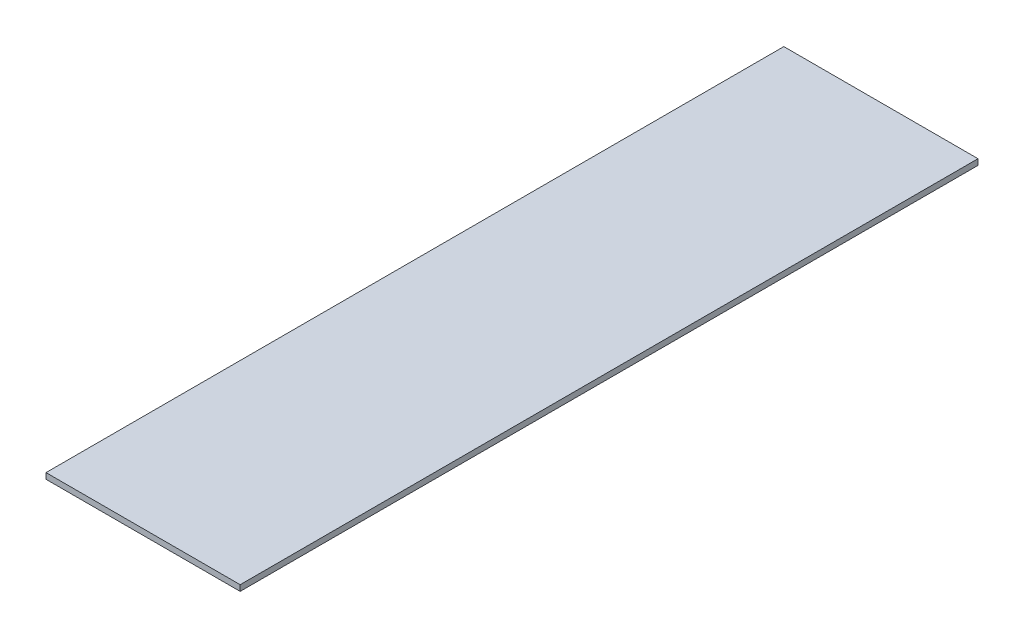
ISO-10303-21;
HEADER;
FILE_DESCRIPTION(('STEP AP214'),'2;1');
FILE_NAME('part.step','',(''),(''),'','','');
FILE_SCHEMA(('AUTOMOTIVE_DESIGN { 1 0 10303 214 1 1 1 1 }'));
ENDSEC;
DATA;
#1=APPLICATION_CONTEXT('core data for automotive mechanical design processes');
#2=APPLICATION_PROTOCOL_DEFINITION('international standard','automotive_design',2000,#1);
#3=PRODUCT_CONTEXT('',#1,'mechanical');
#4=PRODUCT('Part','Part','',(#3));
#5=PRODUCT_RELATED_PRODUCT_CATEGORY('part','',(#4));
#6=PRODUCT_DEFINITION_FORMATION('','',#4);
#7=PRODUCT_DEFINITION_CONTEXT('part definition',#1,'design');
#8=PRODUCT_DEFINITION('design','',#6,#7);
#9=PRODUCT_DEFINITION_SHAPE('','',#8);
#10=(LENGTH_UNIT() NAMED_UNIT(*) SI_UNIT(.MILLI.,.METRE.));
#11=(NAMED_UNIT(*) PLANE_ANGLE_UNIT() SI_UNIT($,.RADIAN.));
#12=(NAMED_UNIT(*) SI_UNIT($,.STERADIAN.) SOLID_ANGLE_UNIT());
#13=UNCERTAINTY_MEASURE_WITH_UNIT(LENGTH_MEASURE(1.E-05),#10,'distance_accuracy_value','');
#14=(GEOMETRIC_REPRESENTATION_CONTEXT(3) GLOBAL_UNCERTAINTY_ASSIGNED_CONTEXT((#13)) GLOBAL_UNIT_ASSIGNED_CONTEXT((#10,
#11,#12)) REPRESENTATION_CONTEXT('',''));
#15=CARTESIAN_POINT('',(0.,0.,0.));
#16=DIRECTION('',(0.,0.,1.));
#17=DIRECTION('',(1.,0.,0.));
#18=AXIS2_PLACEMENT_3D('',#15,#16,#17);
#19=CARTESIAN_POINT('',(0.,1.905,0.));
#20=DIRECTION('',(1.,0.,0.));
#21=DIRECTION('',(0.,0.,-1.));
#22=AXIS2_PLACEMENT_3D('',#19,#20,#21);
#23=PLANE('',#22);
#24=DIRECTION('',(0.,0.,1.));
#25=VECTOR('',#24,1.);
#26=CARTESIAN_POINT('',(0.,0.,0.));
#27=LINE('',#26,#25);
#28=CARTESIAN_POINT('',(0.,0.,-241.3));
#29=VERTEX_POINT('',#28);
#30=CARTESIAN_POINT('',(0.,0.,0.));
#31=VERTEX_POINT('',#30);
#32=EDGE_CURVE('E111',#29,#31,#27,.T.);
#33=ORIENTED_EDGE('',*,*,#32,.T.);
#34=DIRECTION('',(0.,-1.,0.));
#35=VECTOR('',#34,1.);
#36=CARTESIAN_POINT('',(0.,1.905,0.));
#37=LINE('',#36,#35);
#38=CARTESIAN_POINT('',(0.,1.905,0.));
#39=VERTEX_POINT('',#38);
#40=EDGE_CURVE('E11',#39,#31,#37,.T.);
#41=ORIENTED_EDGE('',*,*,#40,.F.);
#42=DIRECTION('',(0.,0.,1.));
#43=VECTOR('',#42,1.);
#44=CARTESIAN_POINT('',(0.,1.905,0.));
#45=LINE('',#44,#43);
#46=CARTESIAN_POINT('',(0.,1.905,-241.3));
#47=VERTEX_POINT('',#46);
#48=EDGE_CURVE('E95',#47,#39,#45,.T.);
#49=ORIENTED_EDGE('',*,*,#48,.F.);
#50=DIRECTION('',(0.,-1.,0.));
#51=VECTOR('',#50,1.);
#52=CARTESIAN_POINT('',(0.,1.905,-241.3));
#53=LINE('',#52,#51);
#54=EDGE_CURVE('E107',#47,#29,#53,.T.);
#55=ORIENTED_EDGE('',*,*,#54,.T.);
#56=EDGE_LOOP('',(#33,#41,#49,#55));
#57=FACE_BOUND('',#56,.T.);
#58=ADVANCED_FACE('F43',(#57),#23,.F.);
#59=CARTESIAN_POINT('',(0.,1.905,0.));
#60=DIRECTION('',(0.,0.,-1.));
#61=DIRECTION('',(-1.,0.,0.));
#62=AXIS2_PLACEMENT_3D('',#59,#60,#61);
#63=PLANE('',#62);
#64=DIRECTION('',(1.,0.,0.));
#65=VECTOR('',#64,1.);
#66=CARTESIAN_POINT('',(0.,0.,0.));
#67=LINE('',#66,#65);
#68=CARTESIAN_POINT('',(63.5,0.,0.));
#69=VERTEX_POINT('',#68);
#70=EDGE_CURVE('E100',#31,#69,#67,.T.);
#71=ORIENTED_EDGE('',*,*,#70,.T.);
#72=DIRECTION('',(0.,-1.,0.));
#73=VECTOR('',#72,1.);
#74=CARTESIAN_POINT('',(63.5,1.905,0.));
#75=LINE('',#74,#73);
#76=CARTESIAN_POINT('',(63.5,1.905,0.));
#77=VERTEX_POINT('',#76);
#78=EDGE_CURVE('E52',#77,#69,#75,.T.);
#79=ORIENTED_EDGE('',*,*,#78,.F.);
#80=DIRECTION('',(1.,0.,0.));
#81=VECTOR('',#80,1.);
#82=CARTESIAN_POINT('',(0.,1.905,0.));
#83=LINE('',#82,#81);
#84=EDGE_CURVE('E90',#39,#77,#83,.T.);
#85=ORIENTED_EDGE('',*,*,#84,.F.);
#86=ORIENTED_EDGE('',*,*,#40,.T.);
#87=EDGE_LOOP('',(#71,#79,#85,#86));
#88=FACE_BOUND('',#87,.T.);
#89=ADVANCED_FACE('F99',(#88),#63,.F.);
#90=CARTESIAN_POINT('',(63.5,1.905,0.));
#91=DIRECTION('',(-1.,0.,0.));
#92=DIRECTION('',(0.,0.,1.));
#93=AXIS2_PLACEMENT_3D('',#90,#91,#92);
#94=PLANE('',#93);
#95=DIRECTION('',(0.,0.,-1.));
#96=VECTOR('',#95,1.);
#97=CARTESIAN_POINT('',(63.5,0.,0.));
#98=LINE('',#97,#96);
#99=CARTESIAN_POINT('',(63.5,0.,-241.3));
#100=VERTEX_POINT('',#99);
#101=EDGE_CURVE('E77',#69,#100,#98,.T.);
#102=ORIENTED_EDGE('',*,*,#101,.T.);
#103=DIRECTION('',(0.,-1.,0.));
#104=VECTOR('',#103,1.);
#105=CARTESIAN_POINT('',(63.5,1.905,-241.3));
#106=LINE('',#105,#104);
#107=CARTESIAN_POINT('',(63.5,1.905,-241.3));
#108=VERTEX_POINT('',#107);
#109=EDGE_CURVE('E102',#108,#100,#106,.T.);
#110=ORIENTED_EDGE('',*,*,#109,.F.);
#111=DIRECTION('',(0.,0.,-1.));
#112=VECTOR('',#111,1.);
#113=CARTESIAN_POINT('',(63.5,1.905,0.));
#114=LINE('',#113,#112);
#115=EDGE_CURVE('E93',#77,#108,#114,.T.);
#116=ORIENTED_EDGE('',*,*,#115,.F.);
#117=ORIENTED_EDGE('',*,*,#78,.T.);
#118=EDGE_LOOP('',(#102,#110,#116,#117));
#119=FACE_BOUND('',#118,.T.);
#120=ADVANCED_FACE('F103',(#119),#94,.F.);
#121=CARTESIAN_POINT('',(0.,1.905,-241.3));
#122=DIRECTION('',(0.,0.,1.));
#123=DIRECTION('',(1.,0.,0.));
#124=AXIS2_PLACEMENT_3D('',#121,#122,#123);
#125=PLANE('',#124);
#126=DIRECTION('',(-1.,0.,0.));
#127=VECTOR('',#126,1.);
#128=CARTESIAN_POINT('',(0.,0.,-241.3));
#129=LINE('',#128,#127);
#130=EDGE_CURVE('E83',#100,#29,#129,.T.);
#131=ORIENTED_EDGE('',*,*,#130,.T.);
#132=ORIENTED_EDGE('',*,*,#54,.F.);
#133=DIRECTION('',(-1.,0.,0.));
#134=VECTOR('',#133,1.);
#135=CARTESIAN_POINT('',(0.,1.905,-241.3));
#136=LINE('',#135,#134);
#137=EDGE_CURVE('E60',#108,#47,#136,.T.);
#138=ORIENTED_EDGE('',*,*,#137,.F.);
#139=ORIENTED_EDGE('',*,*,#109,.T.);
#140=EDGE_LOOP('',(#131,#132,#138,#139));
#141=FACE_BOUND('',#140,.T.);
#142=ADVANCED_FACE('F124',(#141),#125,.F.);
#143=CARTESIAN_POINT('',(0.,1.905,0.));
#144=DIRECTION('',(0.,-1.,0.));
#145=DIRECTION('',(0.,0.,-1.));
#146=AXIS2_PLACEMENT_3D('',#143,#144,#145);
#147=PLANE('',#146);
#148=ORIENTED_EDGE('',*,*,#48,.T.);
#149=ORIENTED_EDGE('',*,*,#84,.T.);
#150=ORIENTED_EDGE('',*,*,#115,.T.);
#151=ORIENTED_EDGE('',*,*,#137,.T.);
#152=EDGE_LOOP('',(#148,#149,#150,#151));
#153=FACE_BOUND('',#152,.T.);
#154=ADVANCED_FACE('F91',(#153),#147,.F.);
#155=CARTESIAN_POINT('',(0.,0.,0.));
#156=DIRECTION('',(0.,-1.,0.));
#157=DIRECTION('',(0.,0.,-1.));
#158=AXIS2_PLACEMENT_3D('',#155,#156,#157);
#159=PLANE('',#158);
#160=ORIENTED_EDGE('',*,*,#32,.F.);
#161=ORIENTED_EDGE('',*,*,#130,.F.);
#162=ORIENTED_EDGE('',*,*,#101,.F.);
#163=ORIENTED_EDGE('',*,*,#70,.F.);
#164=EDGE_LOOP('',(#160,#161,#162,#163));
#165=FACE_BOUND('',#164,.T.);
#166=ADVANCED_FACE('F127',(#165),#159,.T.);
#167=CLOSED_SHELL('',(#58,#89,#120,#142,#154,#166));
#168=MANIFOLD_SOLID_BREP('B2',#167);
#169=ADVANCED_BREP_SHAPE_REPRESENTATION('',(#18,#168),#14);
#170=SHAPE_DEFINITION_REPRESENTATION(#9,#169);
ENDSEC;
END-ISO-10303-21;
